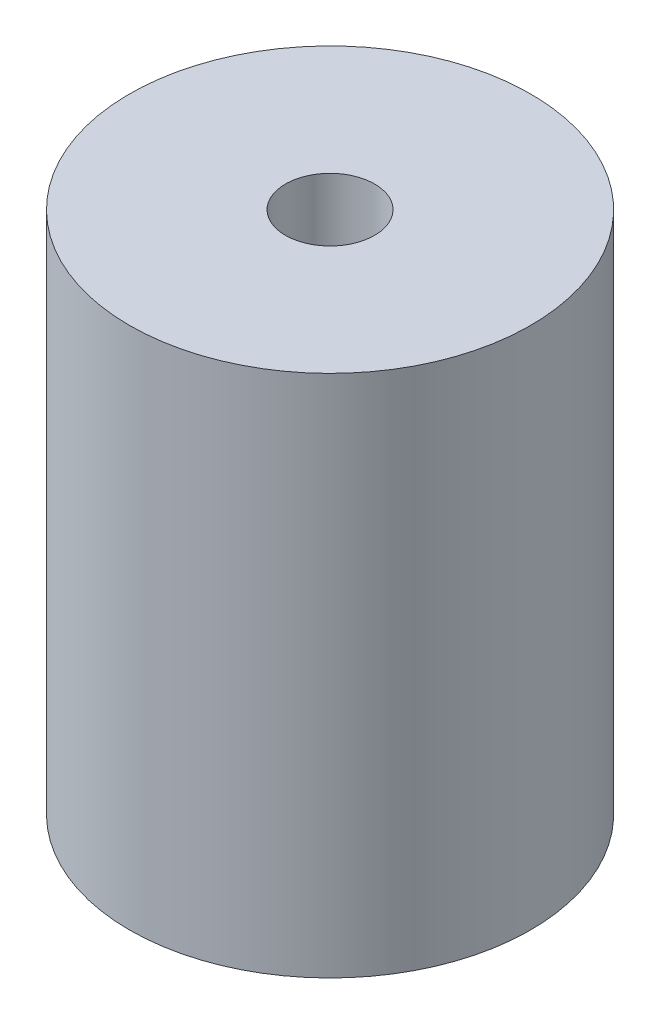
ISO-10303-21;
HEADER;
FILE_DESCRIPTION(('STEP AP214'),'2;1');
FILE_NAME('part.step','',(''),(''),'','','');
FILE_SCHEMA(('AUTOMOTIVE_DESIGN { 1 0 10303 214 1 1 1 1 }'));
ENDSEC;
DATA;
#1=APPLICATION_CONTEXT('core data for automotive mechanical design processes');
#2=APPLICATION_PROTOCOL_DEFINITION('international standard','automotive_design',2000,#1);
#3=PRODUCT_CONTEXT('',#1,'mechanical');
#4=PRODUCT('Part','Part','',(#3));
#5=PRODUCT_RELATED_PRODUCT_CATEGORY('part','',(#4));
#6=PRODUCT_DEFINITION_FORMATION('','',#4);
#7=PRODUCT_DEFINITION_CONTEXT('part definition',#1,'design');
#8=PRODUCT_DEFINITION('design','',#6,#7);
#9=PRODUCT_DEFINITION_SHAPE('','',#8);
#10=(LENGTH_UNIT() NAMED_UNIT(*) SI_UNIT(.MILLI.,.METRE.));
#11=(NAMED_UNIT(*) PLANE_ANGLE_UNIT() SI_UNIT($,.RADIAN.));
#12=(NAMED_UNIT(*) SI_UNIT($,.STERADIAN.) SOLID_ANGLE_UNIT());
#13=UNCERTAINTY_MEASURE_WITH_UNIT(LENGTH_MEASURE(1.E-05),#10,'distance_accuracy_value','');
#14=(GEOMETRIC_REPRESENTATION_CONTEXT(3) GLOBAL_UNCERTAINTY_ASSIGNED_CONTEXT((#13)) GLOBAL_UNIT_ASSIGNED_CONTEXT((#10,
#11,#12)) REPRESENTATION_CONTEXT('',''));
#15=CARTESIAN_POINT('',(0.,0.,0.));
#16=DIRECTION('',(0.,0.,1.));
#17=DIRECTION('',(1.,0.,0.));
#18=AXIS2_PLACEMENT_3D('',#15,#16,#17);
#19=CARTESIAN_POINT('',(0.,-47.,0.));
#20=DIRECTION('',(0.,1.,0.));
#21=DIRECTION('',(0.,0.,1.));
#22=AXIS2_PLACEMENT_3D('',#19,#20,#21);
#23=CYLINDRICAL_SURFACE('',#22,18.);
#24=CARTESIAN_POINT('',(0.,-47.,0.));
#25=DIRECTION('',(0.,1.,0.));
#26=DIRECTION('',(0.,0.,1.));
#27=AXIS2_PLACEMENT_3D('',#24,#25,#26);
#28=CIRCLE('',#27,18.);
#29=CARTESIAN_POINT('',(0.,-47.,18.));
#30=VERTEX_POINT('',#29);
#31=EDGE_CURVE('E10',#30,#30,#28,.T.);
#32=ORIENTED_EDGE('',*,*,#31,.T.);
#33=EDGE_LOOP('',(#32));
#34=FACE_BOUND('',#33,.T.);
#35=CARTESIAN_POINT('',(0.,0.,0.));
#36=DIRECTION('',(0.,1.,0.));
#37=DIRECTION('',(0.,0.,1.));
#38=AXIS2_PLACEMENT_3D('',#35,#36,#37);
#39=CIRCLE('',#38,18.);
#40=CARTESIAN_POINT('',(0.,0.,18.));
#41=VERTEX_POINT('',#40);
#42=EDGE_CURVE('E33',#41,#41,#39,.T.);
#43=ORIENTED_EDGE('',*,*,#42,.F.);
#44=EDGE_LOOP('',(#43));
#45=FACE_BOUND('',#44,.T.);
#46=ADVANCED_FACE('F30',(#34,#45),#23,.T.);
#47=CARTESIAN_POINT('',(0.,-47.,0.));
#48=DIRECTION('',(0.,1.,0.));
#49=DIRECTION('',(0.,0.,1.));
#50=AXIS2_PLACEMENT_3D('',#47,#48,#49);
#51=PLANE('',#50);
#52=CARTESIAN_POINT('',(0.,-47.,0.));
#53=DIRECTION('',(0.,1.,0.));
#54=DIRECTION('',(0.,0.,1.));
#55=AXIS2_PLACEMENT_3D('',#52,#53,#54);
#56=CIRCLE('',#55,4.);
#57=CARTESIAN_POINT('',(0.,-47.,4.));
#58=VERTEX_POINT('',#57);
#59=EDGE_CURVE('E40',#58,#58,#56,.T.);
#60=ORIENTED_EDGE('',*,*,#59,.T.);
#61=EDGE_LOOP('',(#60));
#62=FACE_BOUND('',#61,.T.);
#63=ORIENTED_EDGE('',*,*,#31,.F.);
#64=EDGE_LOOP('',(#63));
#65=FACE_BOUND('',#64,.T.);
#66=ADVANCED_FACE('F48',(#62,#65),#51,.F.);
#67=CARTESIAN_POINT('',(0.,0.,0.));
#68=DIRECTION('',(0.,1.,0.));
#69=DIRECTION('',(0.,0.,1.));
#70=AXIS2_PLACEMENT_3D('',#67,#68,#69);
#71=PLANE('',#70);
#72=CARTESIAN_POINT('',(0.,0.,0.));
#73=DIRECTION('',(0.,1.,0.));
#74=DIRECTION('',(0.,0.,1.));
#75=AXIS2_PLACEMENT_3D('',#72,#73,#74);
#76=CIRCLE('',#75,4.);
#77=CARTESIAN_POINT('',(0.,0.,4.));
#78=VERTEX_POINT('',#77);
#79=EDGE_CURVE('E42',#78,#78,#76,.T.);
#80=ORIENTED_EDGE('',*,*,#79,.F.);
#81=EDGE_LOOP('',(#80));
#82=FACE_BOUND('',#81,.T.);
#83=ORIENTED_EDGE('',*,*,#42,.T.);
#84=EDGE_LOOP('',(#83));
#85=FACE_BOUND('',#84,.T.);
#86=ADVANCED_FACE('F54',(#82,#85),#71,.T.);
#87=CARTESIAN_POINT('',(0.,-47.,0.));
#88=DIRECTION('',(0.,1.,0.));
#89=DIRECTION('',(0.,0.,1.));
#90=AXIS2_PLACEMENT_3D('',#87,#88,#89);
#91=CYLINDRICAL_SURFACE('',#90,4.);
#92=ORIENTED_EDGE('',*,*,#59,.F.);
#93=EDGE_LOOP('',(#92));
#94=FACE_BOUND('',#93,.T.);
#95=ORIENTED_EDGE('',*,*,#79,.T.);
#96=EDGE_LOOP('',(#95));
#97=FACE_BOUND('',#96,.T.);
#98=ADVANCED_FACE('F51',(#94,#97),#91,.F.);
#99=CLOSED_SHELL('',(#46,#66,#86,#98));
#100=MANIFOLD_SOLID_BREP('B2',#99);
#101=ADVANCED_BREP_SHAPE_REPRESENTATION('',(#18,#100),#14);
#102=SHAPE_DEFINITION_REPRESENTATION(#9,#101);
ENDSEC;
END-ISO-10303-21;
